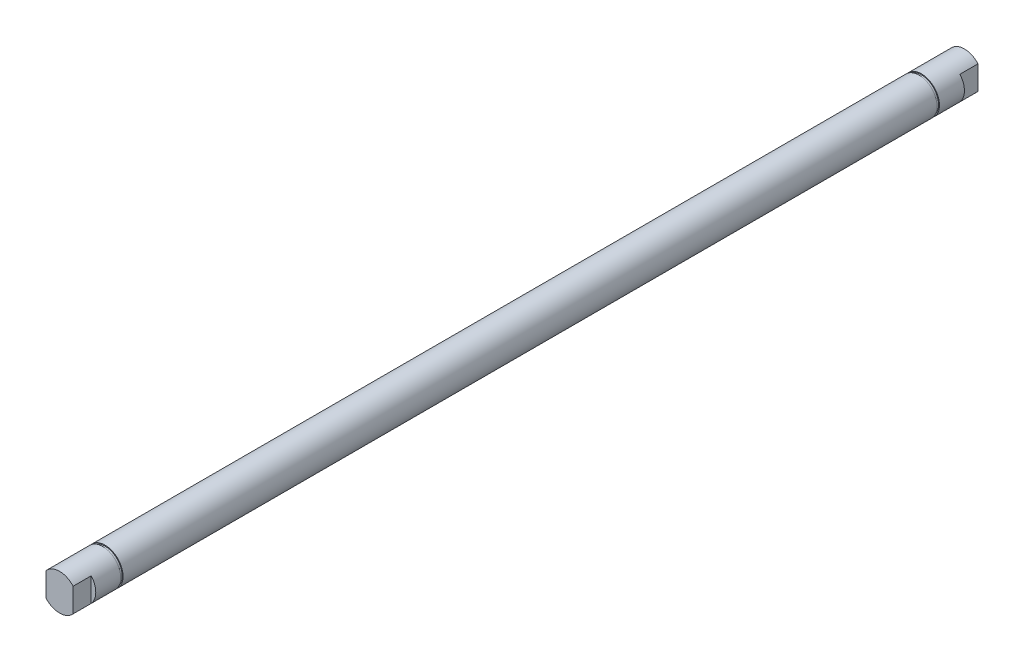
ISO-10303-21;
HEADER;
FILE_DESCRIPTION(('STEP AP214'),'2;1');
FILE_NAME('part.step','',(''),(''),'','','');
FILE_SCHEMA(('AUTOMOTIVE_DESIGN { 1 0 10303 214 1 1 1 1 }'));
ENDSEC;
DATA;
#1=APPLICATION_CONTEXT('core data for automotive mechanical design processes');
#2=APPLICATION_PROTOCOL_DEFINITION('international standard','automotive_design',2000,#1);
#3=PRODUCT_CONTEXT('',#1,'mechanical');
#4=PRODUCT('Part','Part','',(#3));
#5=PRODUCT_RELATED_PRODUCT_CATEGORY('part','',(#4));
#6=PRODUCT_DEFINITION_FORMATION('','',#4);
#7=PRODUCT_DEFINITION_CONTEXT('part definition',#1,'design');
#8=PRODUCT_DEFINITION('design','',#6,#7);
#9=PRODUCT_DEFINITION_SHAPE('','',#8);
#10=(LENGTH_UNIT() NAMED_UNIT(*) SI_UNIT(.MILLI.,.METRE.));
#11=(NAMED_UNIT(*) PLANE_ANGLE_UNIT() SI_UNIT($,.RADIAN.));
#12=(NAMED_UNIT(*) SI_UNIT($,.STERADIAN.) SOLID_ANGLE_UNIT());
#13=UNCERTAINTY_MEASURE_WITH_UNIT(LENGTH_MEASURE(1.E-05),#10,'distance_accuracy_value','');
#14=(GEOMETRIC_REPRESENTATION_CONTEXT(3) GLOBAL_UNCERTAINTY_ASSIGNED_CONTEXT((#13)) GLOBAL_UNIT_ASSIGNED_CONTEXT((#10,
#11,#12)) REPRESENTATION_CONTEXT('',''));
#15=CARTESIAN_POINT('',(0.,0.,0.));
#16=DIRECTION('',(0.,0.,1.));
#17=DIRECTION('',(1.,0.,0.));
#18=AXIS2_PLACEMENT_3D('',#15,#16,#17);
#19=CARTESIAN_POINT('',(0.,0.,250.));
#20=DIRECTION('',(0.,0.,-1.));
#21=DIRECTION('',(-1.,0.,0.));
#22=AXIS2_PLACEMENT_3D('',#19,#20,#21);
#23=CYLINDRICAL_SURFACE('',#22,10.);
#24=CARTESIAN_POINT('',(0.,0.,-224.9));
#25=DIRECTION('',(0.,0.,1.));
#26=DIRECTION('',(1.,0.,0.));
#27=AXIS2_PLACEMENT_3D('',#24,#25,#26);
#28=CIRCLE('',#27,9.99999999999999);
#29=CARTESIAN_POINT('',(9.99999999999999,0.,-224.9));
#30=VERTEX_POINT('',#29);
#31=EDGE_CURVE('E159',#30,#30,#28,.T.);
#32=ORIENTED_EDGE('',*,*,#31,.T.);
#33=EDGE_LOOP('',(#32));
#34=FACE_BOUND('',#33,.T.);
#35=CARTESIAN_POINT('',(0.,0.,224.9));
#36=DIRECTION('',(0.,0.,1.));
#37=DIRECTION('',(1.,0.,0.));
#38=AXIS2_PLACEMENT_3D('',#35,#36,#37);
#39=CIRCLE('',#38,9.99999999999999);
#40=CARTESIAN_POINT('',(9.99999999999999,0.,224.9));
#41=VERTEX_POINT('',#40);
#42=EDGE_CURVE('E183',#41,#41,#39,.T.);
#43=ORIENTED_EDGE('',*,*,#42,.F.);
#44=EDGE_LOOP('',(#43));
#45=FACE_BOUND('',#44,.T.);
#46=ADVANCED_FACE('F45',(#34,#45),#23,.T.);
#47=CARTESIAN_POINT('',(0.,0.,226.2));
#48=DIRECTION('',(0.,0.,1.));
#49=DIRECTION('',(1.,0.,0.));
#50=AXIS2_PLACEMENT_3D('',#47,#48,#49);
#51=CIRCLE('',#50,9.99999999999999);
#52=CARTESIAN_POINT('',(9.99999999999999,0.,226.2));
#53=VERTEX_POINT('',#52);
#54=EDGE_CURVE('E176',#53,#53,#51,.T.);
#55=ORIENTED_EDGE('',*,*,#54,.T.);
#56=EDGE_LOOP('',(#55));
#57=FACE_BOUND('',#56,.T.);
#58=CARTESIAN_POINT('',(0.,0.,250.));
#59=DIRECTION('',(0.,0.,1.));
#60=DIRECTION('',(1.,0.,0.));
#61=AXIS2_PLACEMENT_3D('',#58,#59,#60);
#62=CIRCLE('',#61,10.);
#63=CARTESIAN_POINT('',(-7.5,-6.61437827766148,250.));
#64=VERTEX_POINT('',#63);
#65=CARTESIAN_POINT('',(7.5,-6.61437827766148,250.));
#66=VERTEX_POINT('',#65);
#67=EDGE_CURVE('E123',#64,#66,#62,.T.);
#68=ORIENTED_EDGE('',*,*,#67,.F.);
#69=DIRECTION('',(0.,0.,-1.));
#70=VECTOR('',#69,1.);
#71=CARTESIAN_POINT('',(-7.5,-6.61437827766148,250.));
#72=LINE('',#71,#70);
#73=CARTESIAN_POINT('',(-7.5,-6.61437827766148,240.));
#74=VERTEX_POINT('',#73);
#75=EDGE_CURVE('E59',#64,#74,#72,.T.);
#76=ORIENTED_EDGE('',*,*,#75,.T.);
#77=CARTESIAN_POINT('',(0.,0.,240.));
#78=DIRECTION('',(0.,0.,1.));
#79=DIRECTION('',(1.,0.,0.));
#80=AXIS2_PLACEMENT_3D('',#77,#78,#79);
#81=CIRCLE('',#80,10.);
#82=CARTESIAN_POINT('',(-7.5,6.61437827766148,240.));
#83=VERTEX_POINT('',#82);
#84=EDGE_CURVE('E12',#83,#74,#81,.T.);
#85=ORIENTED_EDGE('',*,*,#84,.F.);
#86=DIRECTION('',(0.,0.,-1.));
#87=VECTOR('',#86,1.);
#88=CARTESIAN_POINT('',(-7.5,6.61437827766148,250.));
#89=LINE('',#88,#87);
#90=CARTESIAN_POINT('',(-7.5,6.61437827766148,250.));
#91=VERTEX_POINT('',#90);
#92=EDGE_CURVE('E151',#83,#91,#89,.F.);
#93=ORIENTED_EDGE('',*,*,#92,.T.);
#94=CARTESIAN_POINT('',(7.5,6.61437827766148,250.));
#95=VERTEX_POINT('',#94);
#96=EDGE_CURVE('E127',#95,#91,#62,.T.);
#97=ORIENTED_EDGE('',*,*,#96,.F.);
#98=DIRECTION('',(0.,0.,-1.));
#99=VECTOR('',#98,1.);
#100=CARTESIAN_POINT('',(7.5,6.61437827766148,250.));
#101=LINE('',#100,#99);
#102=CARTESIAN_POINT('',(7.5,6.61437827766148,240.));
#103=VERTEX_POINT('',#102);
#104=EDGE_CURVE('E67',#95,#103,#101,.T.);
#105=ORIENTED_EDGE('',*,*,#104,.T.);
#106=CARTESIAN_POINT('',(7.5,-6.61437827766148,240.));
#107=VERTEX_POINT('',#106);
#108=EDGE_CURVE('E48',#107,#103,#81,.T.);
#109=ORIENTED_EDGE('',*,*,#108,.F.);
#110=DIRECTION('',(0.,0.,-1.));
#111=VECTOR('',#110,1.);
#112=CARTESIAN_POINT('',(7.5,-6.61437827766148,250.));
#113=LINE('',#112,#111);
#114=EDGE_CURVE('E110',#107,#66,#113,.F.);
#115=ORIENTED_EDGE('',*,*,#114,.T.);
#116=EDGE_LOOP('',(#68,#76,#85,#93,#97,#105,#109,#115));
#117=FACE_BOUND('',#116,.T.);
#118=ADVANCED_FACE('F122',(#57,#117),#23,.T.);
#119=CARTESIAN_POINT('',(0.,0.,250.));
#120=DIRECTION('',(0.,0.,1.));
#121=DIRECTION('',(1.,0.,0.));
#122=AXIS2_PLACEMENT_3D('',#119,#120,#121);
#123=PLANE('',#122);
#124=DIRECTION('',(0.,1.,0.));
#125=VECTOR('',#124,1.);
#126=CARTESIAN_POINT('',(-7.5,0.,250.));
#127=LINE('',#126,#125);
#128=EDGE_CURVE('E116',#64,#91,#127,.T.);
#129=ORIENTED_EDGE('',*,*,#128,.F.);
#130=ORIENTED_EDGE('',*,*,#67,.T.);
#131=DIRECTION('',(0.,-1.,0.));
#132=VECTOR('',#131,1.);
#133=CARTESIAN_POINT('',(7.5,0.,250.));
#134=LINE('',#133,#132);
#135=EDGE_CURVE('E107',#95,#66,#134,.T.);
#136=ORIENTED_EDGE('',*,*,#135,.F.);
#137=ORIENTED_EDGE('',*,*,#96,.T.);
#138=EDGE_LOOP('',(#129,#130,#136,#137));
#139=FACE_BOUND('',#138,.T.);
#140=ADVANCED_FACE('F126',(#139),#123,.T.);
#141=CARTESIAN_POINT('',(9.99999999999999,0.,226.2));
#142=DIRECTION('',(0.,0.,1.));
#143=DIRECTION('',(1.,0.,0.));
#144=AXIS2_PLACEMENT_3D('',#141,#142,#143);
#145=PLANE('',#144);
#146=ORIENTED_EDGE('',*,*,#54,.F.);
#147=EDGE_LOOP('',(#146));
#148=FACE_BOUND('',#147,.T.);
#149=CARTESIAN_POINT('',(0.,0.,226.2));
#150=DIRECTION('',(0.,0.,1.));
#151=DIRECTION('',(1.,0.,0.));
#152=AXIS2_PLACEMENT_3D('',#149,#150,#151);
#153=CIRCLE('',#152,9.49999999999999);
#154=CARTESIAN_POINT('',(9.49999999999999,0.,226.2));
#155=VERTEX_POINT('',#154);
#156=EDGE_CURVE('E135',#155,#155,#153,.T.);
#157=ORIENTED_EDGE('',*,*,#156,.T.);
#158=EDGE_LOOP('',(#157));
#159=FACE_BOUND('',#158,.T.);
#160=ADVANCED_FACE('F359',(#148,#159),#145,.F.);
#161=CARTESIAN_POINT('',(0.,0.,250.));
#162=DIRECTION('',(0.,0.,1.));
#163=DIRECTION('',(1.,0.,0.));
#164=AXIS2_PLACEMENT_3D('',#161,#162,#163);
#165=CYLINDRICAL_SURFACE('',#164,9.49999999999999);
#166=ORIENTED_EDGE('',*,*,#156,.F.);
#167=EDGE_LOOP('',(#166));
#168=FACE_BOUND('',#167,.T.);
#169=CARTESIAN_POINT('',(0.,0.,224.9));
#170=DIRECTION('',(0.,0.,1.));
#171=DIRECTION('',(1.,0.,0.));
#172=AXIS2_PLACEMENT_3D('',#169,#170,#171);
#173=CIRCLE('',#172,9.49999999999999);
#174=CARTESIAN_POINT('',(9.49999999999999,0.,224.9));
#175=VERTEX_POINT('',#174);
#176=EDGE_CURVE('E185',#175,#175,#173,.T.);
#177=ORIENTED_EDGE('',*,*,#176,.T.);
#178=EDGE_LOOP('',(#177));
#179=FACE_BOUND('',#178,.T.);
#180=ADVANCED_FACE('F349',(#168,#179),#165,.T.);
#181=CARTESIAN_POINT('',(9.99999999999999,0.,224.9));
#182=DIRECTION('',(0.,0.,-1.));
#183=DIRECTION('',(-1.,0.,0.));
#184=AXIS2_PLACEMENT_3D('',#181,#182,#183);
#185=PLANE('',#184);
#186=ORIENTED_EDGE('',*,*,#176,.F.);
#187=EDGE_LOOP('',(#186));
#188=FACE_BOUND('',#187,.T.);
#189=ORIENTED_EDGE('',*,*,#42,.T.);
#190=EDGE_LOOP('',(#189));
#191=FACE_BOUND('',#190,.T.);
#192=ADVANCED_FACE('F247',(#188,#191),#185,.F.);
#193=CARTESIAN_POINT('',(9.99999999999999,0.,-226.2));
#194=DIRECTION('',(0.,0.,-1.));
#195=DIRECTION('',(1.,0.,0.));
#196=AXIS2_PLACEMENT_3D('',#193,#194,#195);
#197=PLANE('',#196);
#198=CARTESIAN_POINT('',(0.,0.,-226.2));
#199=DIRECTION('',(0.,0.,1.));
#200=DIRECTION('',(1.,0.,0.));
#201=AXIS2_PLACEMENT_3D('',#198,#199,#200);
#202=CIRCLE('',#201,9.99999999999999);
#203=CARTESIAN_POINT('',(9.99999999999999,0.,-226.2));
#204=VERTEX_POINT('',#203);
#205=EDGE_CURVE('E156',#204,#204,#202,.T.);
#206=ORIENTED_EDGE('',*,*,#205,.T.);
#207=EDGE_LOOP('',(#206));
#208=FACE_BOUND('',#207,.T.);
#209=CARTESIAN_POINT('',(0.,0.,-226.2));
#210=DIRECTION('',(0.,0.,1.));
#211=DIRECTION('',(1.,0.,0.));
#212=AXIS2_PLACEMENT_3D('',#209,#210,#211);
#213=CIRCLE('',#212,9.49999999999999);
#214=CARTESIAN_POINT('',(9.49999999999999,0.,-226.2));
#215=VERTEX_POINT('',#214);
#216=EDGE_CURVE('E165',#215,#215,#213,.T.);
#217=ORIENTED_EDGE('',*,*,#216,.F.);
#218=EDGE_LOOP('',(#217));
#219=FACE_BOUND('',#218,.T.);
#220=ADVANCED_FACE('F244',(#208,#219),#197,.F.);
#221=CARTESIAN_POINT('',(0.,0.,-250.));
#222=DIRECTION('',(0.,0.,-1.));
#223=DIRECTION('',(1.,0.,0.));
#224=AXIS2_PLACEMENT_3D('',#221,#222,#223);
#225=CYLINDRICAL_SURFACE('',#224,9.49999999999999);
#226=ORIENTED_EDGE('',*,*,#216,.T.);
#227=EDGE_LOOP('',(#226));
#228=FACE_BOUND('',#227,.T.);
#229=CARTESIAN_POINT('',(0.,0.,-224.9));
#230=DIRECTION('',(0.,0.,1.));
#231=DIRECTION('',(1.,0.,0.));
#232=AXIS2_PLACEMENT_3D('',#229,#230,#231);
#233=CIRCLE('',#232,9.49999999999999);
#234=CARTESIAN_POINT('',(9.49999999999999,0.,-224.9));
#235=VERTEX_POINT('',#234);
#236=EDGE_CURVE('E162',#235,#235,#233,.T.);
#237=ORIENTED_EDGE('',*,*,#236,.F.);
#238=EDGE_LOOP('',(#237));
#239=FACE_BOUND('',#238,.T.);
#240=ADVANCED_FACE('F220',(#228,#239),#225,.T.);
#241=CARTESIAN_POINT('',(9.99999999999999,0.,-224.9));
#242=DIRECTION('',(0.,0.,1.));
#243=DIRECTION('',(-1.,0.,0.));
#244=AXIS2_PLACEMENT_3D('',#241,#242,#243);
#245=PLANE('',#244);
#246=ORIENTED_EDGE('',*,*,#236,.T.);
#247=EDGE_LOOP('',(#246));
#248=FACE_BOUND('',#247,.T.);
#249=ORIENTED_EDGE('',*,*,#31,.F.);
#250=EDGE_LOOP('',(#249));
#251=FACE_BOUND('',#250,.T.);
#252=ADVANCED_FACE('F211',(#248,#251),#245,.F.);
#253=CARTESIAN_POINT('',(0.,0.,-240.));
#254=DIRECTION('',(0.,0.,-1.));
#255=DIRECTION('',(-1.,0.,0.));
#256=AXIS2_PLACEMENT_3D('',#253,#254,#255);
#257=PLANE('',#256);
#258=CARTESIAN_POINT('',(0.,0.,-240.));
#259=DIRECTION('',(0.,0.,-1.));
#260=DIRECTION('',(-1.,0.,0.));
#261=AXIS2_PLACEMENT_3D('',#258,#259,#260);
#262=CIRCLE('',#261,10.);
#263=CARTESIAN_POINT('',(7.5,6.61437827766148,-240.));
#264=VERTEX_POINT('',#263);
#265=CARTESIAN_POINT('',(7.5,-6.61437827766148,-240.));
#266=VERTEX_POINT('',#265);
#267=EDGE_CURVE('E139',#264,#266,#262,.T.);
#268=ORIENTED_EDGE('',*,*,#267,.T.);
#269=DIRECTION('',(0.,-1.,0.));
#270=VECTOR('',#269,1.);
#271=CARTESIAN_POINT('',(7.5,25.5005577084344,-240.));
#272=LINE('',#271,#270);
#273=EDGE_CURVE('E172',#264,#266,#272,.T.);
#274=ORIENTED_EDGE('',*,*,#273,.F.);
#275=EDGE_LOOP('',(#268,#274));
#276=FACE_BOUND('',#275,.T.);
#277=ADVANCED_FACE('F209',(#276),#257,.T.);
#278=CARTESIAN_POINT('',(7.5,25.5005577084344,-240.));
#279=DIRECTION('',(1.,0.,0.));
#280=DIRECTION('',(0.,1.,0.));
#281=AXIS2_PLACEMENT_3D('',#278,#279,#280);
#282=PLANE('',#281);
#283=DIRECTION('',(0.,0.,-1.));
#284=VECTOR('',#283,1.);
#285=CARTESIAN_POINT('',(7.5,-6.61437827766148,250.));
#286=LINE('',#285,#284);
#287=CARTESIAN_POINT('',(7.5,-6.61437827766148,-250.));
#288=VERTEX_POINT('',#287);
#289=EDGE_CURVE('E141',#266,#288,#286,.T.);
#290=ORIENTED_EDGE('',*,*,#289,.T.);
#291=DIRECTION('',(0.,-1.,0.));
#292=VECTOR('',#291,1.);
#293=CARTESIAN_POINT('',(7.5,25.5005577084344,-250.));
#294=LINE('',#293,#292);
#295=CARTESIAN_POINT('',(7.5,6.61437827766148,-250.));
#296=VERTEX_POINT('',#295);
#297=EDGE_CURVE('E173',#296,#288,#294,.T.);
#298=ORIENTED_EDGE('',*,*,#297,.F.);
#299=DIRECTION('',(0.,0.,-1.));
#300=VECTOR('',#299,1.);
#301=CARTESIAN_POINT('',(7.5,6.61437827766148,250.));
#302=LINE('',#301,#300);
#303=EDGE_CURVE('E130',#296,#264,#302,.F.);
#304=ORIENTED_EDGE('',*,*,#303,.T.);
#305=ORIENTED_EDGE('',*,*,#273,.T.);
#306=EDGE_LOOP('',(#290,#298,#304,#305));
#307=FACE_BOUND('',#306,.T.);
#308=ADVANCED_FACE('F206',(#307),#282,.T.);
#309=CARTESIAN_POINT('',(0.,0.,-250.));
#310=DIRECTION('',(0.,0.,1.));
#311=DIRECTION('',(1.,0.,0.));
#312=AXIS2_PLACEMENT_3D('',#309,#310,#311);
#313=PLANE('',#312);
#314=DIRECTION('',(0.,1.,0.));
#315=VECTOR('',#314,1.);
#316=CARTESIAN_POINT('',(-7.5,25.5005577084344,-250.));
#317=LINE('',#316,#315);
#318=CARTESIAN_POINT('',(-7.5,-6.61437827766148,-250.));
#319=VERTEX_POINT('',#318);
#320=CARTESIAN_POINT('',(-7.5,6.61437827766148,-250.));
#321=VERTEX_POINT('',#320);
#322=EDGE_CURVE('E168',#319,#321,#317,.T.);
#323=ORIENTED_EDGE('',*,*,#322,.T.);
#324=CARTESIAN_POINT('',(0.,0.,-250.));
#325=DIRECTION('',(0.,0.,1.));
#326=DIRECTION('',(1.,0.,0.));
#327=AXIS2_PLACEMENT_3D('',#324,#325,#326);
#328=CIRCLE('',#327,10.);
#329=EDGE_CURVE('E128',#296,#321,#328,.T.);
#330=ORIENTED_EDGE('',*,*,#329,.F.);
#331=ORIENTED_EDGE('',*,*,#297,.T.);
#332=EDGE_CURVE('E132',#319,#288,#328,.T.);
#333=ORIENTED_EDGE('',*,*,#332,.F.);
#334=EDGE_LOOP('',(#323,#330,#331,#333));
#335=FACE_BOUND('',#334,.T.);
#336=ADVANCED_FACE('F202',(#335),#313,.F.);
#337=CARTESIAN_POINT('',(-7.5,-6.61437827766148,-240.));
#338=VERTEX_POINT('',#337);
#339=CARTESIAN_POINT('',(-7.5,6.61437827766148,-240.));
#340=VERTEX_POINT('',#339);
#341=EDGE_CURVE('E142',#338,#340,#262,.T.);
#342=ORIENTED_EDGE('',*,*,#341,.T.);
#343=DIRECTION('',(0.,1.,0.));
#344=VECTOR('',#343,1.);
#345=CARTESIAN_POINT('',(-7.5,25.5005577084344,-240.));
#346=LINE('',#345,#344);
#347=EDGE_CURVE('E169',#338,#340,#346,.T.);
#348=ORIENTED_EDGE('',*,*,#347,.F.);
#349=EDGE_LOOP('',(#342,#348));
#350=FACE_BOUND('',#349,.T.);
#351=ADVANCED_FACE('F213',(#350),#257,.T.);
#352=CARTESIAN_POINT('',(-7.5,25.5005577084344,-240.));
#353=DIRECTION('',(-1.,0.,0.));
#354=DIRECTION('',(0.,-1.,0.));
#355=AXIS2_PLACEMENT_3D('',#352,#353,#354);
#356=PLANE('',#355);
#357=DIRECTION('',(0.,0.,-1.));
#358=VECTOR('',#357,1.);
#359=CARTESIAN_POINT('',(-7.5,6.61437827766148,250.));
#360=LINE('',#359,#358);
#361=EDGE_CURVE('E117',#340,#321,#360,.T.);
#362=ORIENTED_EDGE('',*,*,#361,.T.);
#363=ORIENTED_EDGE('',*,*,#322,.F.);
#364=DIRECTION('',(0.,0.,-1.));
#365=VECTOR('',#364,1.);
#366=CARTESIAN_POINT('',(-7.5,-6.61437827766148,250.));
#367=LINE('',#366,#365);
#368=EDGE_CURVE('E144',#319,#338,#367,.F.);
#369=ORIENTED_EDGE('',*,*,#368,.T.);
#370=ORIENTED_EDGE('',*,*,#347,.T.);
#371=EDGE_LOOP('',(#362,#363,#369,#370));
#372=FACE_BOUND('',#371,.T.);
#373=ADVANCED_FACE('F225',(#372),#356,.T.);
#374=ORIENTED_EDGE('',*,*,#205,.F.);
#375=EDGE_LOOP('',(#374));
#376=FACE_BOUND('',#375,.T.);
#377=ORIENTED_EDGE('',*,*,#361,.F.);
#378=ORIENTED_EDGE('',*,*,#341,.F.);
#379=ORIENTED_EDGE('',*,*,#368,.F.);
#380=ORIENTED_EDGE('',*,*,#332,.T.);
#381=ORIENTED_EDGE('',*,*,#289,.F.);
#382=ORIENTED_EDGE('',*,*,#267,.F.);
#383=ORIENTED_EDGE('',*,*,#303,.F.);
#384=ORIENTED_EDGE('',*,*,#329,.T.);
#385=EDGE_LOOP('',(#377,#378,#379,#380,#381,#382,#383,#384));
#386=FACE_BOUND('',#385,.T.);
#387=ADVANCED_FACE('F198',(#376,#386),#23,.T.);
#388=CARTESIAN_POINT('',(7.5,25.5005577084344,240.));
#389=DIRECTION('',(-1.,0.,0.));
#390=DIRECTION('',(0.,-1.,0.));
#391=AXIS2_PLACEMENT_3D('',#388,#389,#390);
#392=PLANE('',#391);
#393=ORIENTED_EDGE('',*,*,#135,.T.);
#394=ORIENTED_EDGE('',*,*,#114,.F.);
#395=DIRECTION('',(0.,-1.,0.));
#396=VECTOR('',#395,1.);
#397=CARTESIAN_POINT('',(7.5,25.5005577084344,240.));
#398=LINE('',#397,#396);
#399=EDGE_CURVE('E124',#103,#107,#398,.T.);
#400=ORIENTED_EDGE('',*,*,#399,.F.);
#401=ORIENTED_EDGE('',*,*,#104,.F.);
#402=EDGE_LOOP('',(#393,#394,#400,#401));
#403=FACE_BOUND('',#402,.T.);
#404=ADVANCED_FACE('F109',(#403),#392,.F.);
#405=CARTESIAN_POINT('',(0.,0.,240.));
#406=DIRECTION('',(0.,0.,1.));
#407=DIRECTION('',(1.,0.,0.));
#408=AXIS2_PLACEMENT_3D('',#405,#406,#407);
#409=PLANE('',#408);
#410=ORIENTED_EDGE('',*,*,#108,.T.);
#411=ORIENTED_EDGE('',*,*,#399,.T.);
#412=EDGE_LOOP('',(#410,#411));
#413=FACE_BOUND('',#412,.T.);
#414=ADVANCED_FACE('F148',(#413),#409,.T.);
#415=ORIENTED_EDGE('',*,*,#84,.T.);
#416=DIRECTION('',(0.,1.,0.));
#417=VECTOR('',#416,1.);
#418=CARTESIAN_POINT('',(-7.5,25.5005577084344,240.));
#419=LINE('',#418,#417);
#420=EDGE_CURVE('E149',#74,#83,#419,.T.);
#421=ORIENTED_EDGE('',*,*,#420,.T.);
#422=EDGE_LOOP('',(#415,#421));
#423=FACE_BOUND('',#422,.T.);
#424=ADVANCED_FACE('F260',(#423),#409,.T.);
#425=CARTESIAN_POINT('',(-7.5,25.5005577084344,240.));
#426=DIRECTION('',(1.,0.,0.));
#427=DIRECTION('',(0.,1.,0.));
#428=AXIS2_PLACEMENT_3D('',#425,#426,#427);
#429=PLANE('',#428);
#430=ORIENTED_EDGE('',*,*,#128,.T.);
#431=ORIENTED_EDGE('',*,*,#92,.F.);
#432=ORIENTED_EDGE('',*,*,#420,.F.);
#433=ORIENTED_EDGE('',*,*,#75,.F.);
#434=EDGE_LOOP('',(#430,#431,#432,#433));
#435=FACE_BOUND('',#434,.T.);
#436=ADVANCED_FACE('F263',(#435),#429,.F.);
#437=CLOSED_SHELL('',(#46,#118,#140,#160,#180,#192,#220,#240,#252,#277,#308,#336,#351,#373,#387,
#404,#414,#424,#436));
#438=MANIFOLD_SOLID_BREP('B2',#437);
#439=ADVANCED_BREP_SHAPE_REPRESENTATION('',(#18,#438),#14);
#440=SHAPE_DEFINITION_REPRESENTATION(#9,#439);
ENDSEC;
END-ISO-10303-21;
